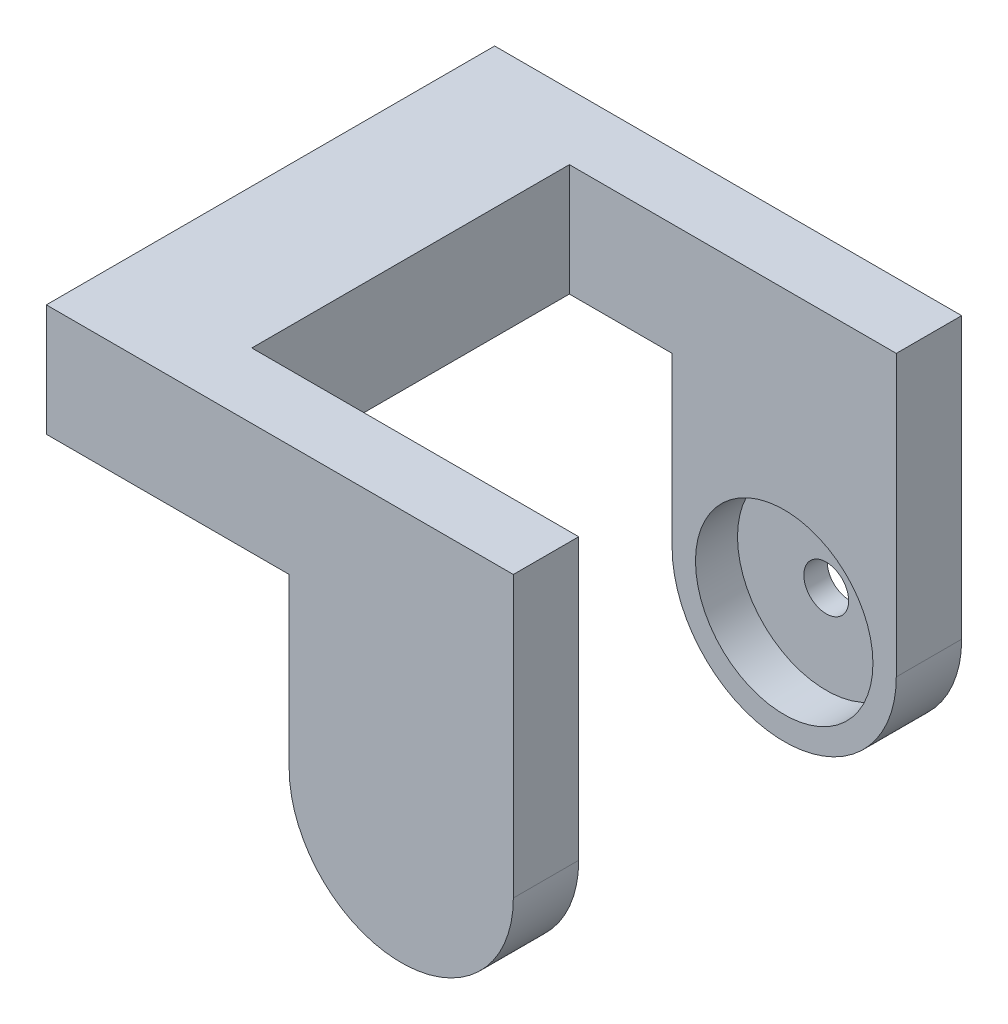
ISO-10303-21;
HEADER;
FILE_DESCRIPTION(('STEP AP214'),'2;1');
FILE_NAME('part.step','',(''),(''),'','','');
FILE_SCHEMA(('AUTOMOTIVE_DESIGN { 1 0 10303 214 1 1 1 1 }'));
ENDSEC;
DATA;
#1=APPLICATION_CONTEXT('core data for automotive mechanical design processes');
#2=APPLICATION_PROTOCOL_DEFINITION('international standard','automotive_design',2000,#1);
#3=PRODUCT_CONTEXT('',#1,'mechanical');
#4=PRODUCT('Part','Part','',(#3));
#5=PRODUCT_RELATED_PRODUCT_CATEGORY('part','',(#4));
#6=PRODUCT_DEFINITION_FORMATION('','',#4);
#7=PRODUCT_DEFINITION_CONTEXT('part definition',#1,'design');
#8=PRODUCT_DEFINITION('design','',#6,#7);
#9=PRODUCT_DEFINITION_SHAPE('','',#8);
#10=(LENGTH_UNIT() NAMED_UNIT(*) SI_UNIT(.MILLI.,.METRE.));
#11=(NAMED_UNIT(*) PLANE_ANGLE_UNIT() SI_UNIT($,.RADIAN.));
#12=(NAMED_UNIT(*) SI_UNIT($,.STERADIAN.) SOLID_ANGLE_UNIT());
#13=UNCERTAINTY_MEASURE_WITH_UNIT(LENGTH_MEASURE(1.E-05),#10,'distance_accuracy_value','');
#14=(GEOMETRIC_REPRESENTATION_CONTEXT(3) GLOBAL_UNCERTAINTY_ASSIGNED_CONTEXT((#13)) GLOBAL_UNIT_ASSIGNED_CONTEXT((#10,
#11,#12)) REPRESENTATION_CONTEXT('',''));
#15=CARTESIAN_POINT('',(0.,0.,0.));
#16=DIRECTION('',(0.,0.,1.));
#17=DIRECTION('',(1.,0.,0.));
#18=AXIS2_PLACEMENT_3D('',#15,#16,#17);
#19=CARTESIAN_POINT('',(12.,0.,-48.));
#20=DIRECTION('',(1.,0.,0.));
#21=DIRECTION('',(0.,0.,-1.));
#22=AXIS2_PLACEMENT_3D('',#19,#20,#21);
#23=PLANE('',#22);
#24=DIRECTION('',(0.,1.,0.));
#25=VECTOR('',#24,1.);
#26=CARTESIAN_POINT('',(12.,-12.,-7.));
#27=LINE('',#26,#25);
#28=CARTESIAN_POINT('',(12.,0.,-7.));
#29=VERTEX_POINT('',#28);
#30=CARTESIAN_POINT('',(12.,30.,-7.));
#31=VERTEX_POINT('',#30);
#32=EDGE_CURVE('E156',#29,#31,#27,.T.);
#33=ORIENTED_EDGE('',*,*,#32,.T.);
#34=DIRECTION('',(0.,0.,1.));
#35=VECTOR('',#34,1.);
#36=CARTESIAN_POINT('',(12.,30.,-48.));
#37=LINE('',#36,#35);
#38=CARTESIAN_POINT('',(12.,30.,0.));
#39=VERTEX_POINT('',#38);
#40=EDGE_CURVE('E170',#31,#39,#37,.T.);
#41=ORIENTED_EDGE('',*,*,#40,.T.);
#42=DIRECTION('',(0.,1.,0.));
#43=VECTOR('',#42,1.);
#44=CARTESIAN_POINT('',(12.,0.,0.));
#45=LINE('',#44,#43);
#46=CARTESIAN_POINT('',(12.,0.,0.));
#47=VERTEX_POINT('',#46);
#48=EDGE_CURVE('E264',#47,#39,#45,.T.);
#49=ORIENTED_EDGE('',*,*,#48,.F.);
#50=DIRECTION('',(0.,0.,1.));
#51=VECTOR('',#50,1.);
#52=CARTESIAN_POINT('',(12.,0.,-48.));
#53=LINE('',#52,#51);
#54=EDGE_CURVE('E91',#29,#47,#53,.T.);
#55=ORIENTED_EDGE('',*,*,#54,.F.);
#56=EDGE_LOOP('',(#33,#41,#49,#55));
#57=FACE_BOUND('',#56,.T.);
#58=ADVANCED_FACE('F47',(#57),#23,.T.);
#59=CARTESIAN_POINT('',(-12.,0.,-48.));
#60=DIRECTION('',(1.,0.,0.));
#61=DIRECTION('',(0.,0.,-1.));
#62=AXIS2_PLACEMENT_3D('',#59,#60,#61);
#63=PLANE('',#62);
#64=DIRECTION('',(0.,1.,0.));
#65=VECTOR('',#64,1.);
#66=CARTESIAN_POINT('',(-12.,0.,0.));
#67=LINE('',#66,#65);
#68=CARTESIAN_POINT('',(-12.,0.,0.));
#69=VERTEX_POINT('',#68);
#70=CARTESIAN_POINT('',(-12.,18.,0.));
#71=VERTEX_POINT('',#70);
#72=EDGE_CURVE('E284',#69,#71,#67,.T.);
#73=ORIENTED_EDGE('',*,*,#72,.T.);
#74=DIRECTION('',(0.,0.,-1.));
#75=VECTOR('',#74,1.);
#76=CARTESIAN_POINT('',(-12.,18.,0.));
#77=LINE('',#76,#75);
#78=CARTESIAN_POINT('',(-12.,18.,-6.99999999999999));
#79=VERTEX_POINT('',#78);
#80=EDGE_CURVE('E229',#71,#79,#77,.T.);
#81=ORIENTED_EDGE('',*,*,#80,.T.);
#82=DIRECTION('',(0.,1.,0.));
#83=VECTOR('',#82,1.);
#84=CARTESIAN_POINT('',(-12.,-12.,-7.));
#85=LINE('',#84,#83);
#86=CARTESIAN_POINT('',(-12.,0.,-7.));
#87=VERTEX_POINT('',#86);
#88=EDGE_CURVE('E248',#87,#79,#85,.T.);
#89=ORIENTED_EDGE('',*,*,#88,.F.);
#90=DIRECTION('',(0.,0.,1.));
#91=VECTOR('',#90,1.);
#92=CARTESIAN_POINT('',(-12.,0.,-48.));
#93=LINE('',#92,#91);
#94=EDGE_CURVE('E169',#87,#69,#93,.T.);
#95=ORIENTED_EDGE('',*,*,#94,.T.);
#96=EDGE_LOOP('',(#73,#81,#89,#95));
#97=FACE_BOUND('',#96,.T.);
#98=ADVANCED_FACE('F341',(#97),#63,.F.);
#99=CARTESIAN_POINT('',(0.,0.,-48.));
#100=DIRECTION('',(0.,0.,1.));
#101=DIRECTION('',(1.,0.,0.));
#102=AXIS2_PLACEMENT_3D('',#99,#100,#101);
#103=CYLINDRICAL_SURFACE('',#102,9.5);
#104=CARTESIAN_POINT('',(0.,0.,-41.));
#105=DIRECTION('',(0.,0.,-1.));
#106=DIRECTION('',(-1.,0.,0.));
#107=AXIS2_PLACEMENT_3D('',#104,#105,#106);
#108=CIRCLE('',#107,9.5);
#109=CARTESIAN_POINT('',(-9.5,0.,-41.));
#110=VERTEX_POINT('',#109);
#111=EDGE_CURVE('E155',#110,#110,#108,.F.);
#112=ORIENTED_EDGE('',*,*,#111,.T.);
#113=EDGE_LOOP('',(#112));
#114=FACE_BOUND('',#113,.T.);
#115=CARTESIAN_POINT('',(0.,0.,-45.5));
#116=DIRECTION('',(0.,0.,-1.));
#117=DIRECTION('',(-1.,0.,0.));
#118=AXIS2_PLACEMENT_3D('',#115,#116,#117);
#119=CIRCLE('',#118,9.5);
#120=CARTESIAN_POINT('',(-9.5,0.,-45.5));
#121=VERTEX_POINT('',#120);
#122=EDGE_CURVE('E182',#121,#121,#119,.F.);
#123=ORIENTED_EDGE('',*,*,#122,.F.);
#124=EDGE_LOOP('',(#123));
#125=FACE_BOUND('',#124,.T.);
#126=ADVANCED_FACE('F346',(#114,#125),#103,.F.);
#127=CARTESIAN_POINT('',(0.,0.,-48.));
#128=DIRECTION('',(0.,0.,1.));
#129=DIRECTION('',(1.,0.,0.));
#130=AXIS2_PLACEMENT_3D('',#127,#128,#129);
#131=CYLINDRICAL_SURFACE('',#130,12.);
#132=CARTESIAN_POINT('',(0.,0.,-7.));
#133=DIRECTION('',(0.,0.,1.));
#134=DIRECTION('',(0.,-1.,0.));
#135=AXIS2_PLACEMENT_3D('',#132,#133,#134);
#136=CIRCLE('',#135,12.);
#137=EDGE_CURVE('E261',#29,#87,#136,.F.);
#138=ORIENTED_EDGE('',*,*,#137,.F.);
#139=ORIENTED_EDGE('',*,*,#54,.T.);
#140=CARTESIAN_POINT('',(0.,0.,0.));
#141=DIRECTION('',(0.,0.,1.));
#142=DIRECTION('',(1.,0.,0.));
#143=AXIS2_PLACEMENT_3D('',#140,#141,#142);
#144=CIRCLE('',#143,12.);
#145=EDGE_CURVE('E267',#69,#47,#144,.T.);
#146=ORIENTED_EDGE('',*,*,#145,.F.);
#147=ORIENTED_EDGE('',*,*,#94,.F.);
#148=EDGE_LOOP('',(#138,#139,#146,#147));
#149=FACE_BOUND('',#148,.T.);
#150=ADVANCED_FACE('F350',(#149),#131,.T.);
#151=CARTESIAN_POINT('',(12.,30.,-48.));
#152=VERTEX_POINT('',#151);
#153=CARTESIAN_POINT('',(12.,30.,-41.));
#154=VERTEX_POINT('',#153);
#155=EDGE_CURVE('E161',#152,#154,#37,.T.);
#156=ORIENTED_EDGE('',*,*,#155,.T.);
#157=DIRECTION('',(0.,-1.,0.));
#158=VECTOR('',#157,1.);
#159=CARTESIAN_POINT('',(12.,-12.,-41.));
#160=LINE('',#159,#158);
#161=CARTESIAN_POINT('',(12.,0.,-41.));
#162=VERTEX_POINT('',#161);
#163=EDGE_CURVE('E145',#154,#162,#160,.T.);
#164=ORIENTED_EDGE('',*,*,#163,.T.);
#165=CARTESIAN_POINT('',(12.,0.,-48.));
#166=VERTEX_POINT('',#165);
#167=EDGE_CURVE('E72',#166,#162,#53,.T.);
#168=ORIENTED_EDGE('',*,*,#167,.F.);
#169=DIRECTION('',(0.,1.,0.));
#170=VECTOR('',#169,1.);
#171=CARTESIAN_POINT('',(12.,0.,-48.));
#172=LINE('',#171,#170);
#173=EDGE_CURVE('E167',#166,#152,#172,.T.);
#174=ORIENTED_EDGE('',*,*,#173,.T.);
#175=EDGE_LOOP('',(#156,#164,#168,#174));
#176=FACE_BOUND('',#175,.T.);
#177=ADVANCED_FACE('F49',(#176),#23,.T.);
#178=CARTESIAN_POINT('',(0.,0.,-41.));
#179=DIRECTION('',(0.,0.,-1.));
#180=DIRECTION('',(-1.,0.,0.));
#181=AXIS2_PLACEMENT_3D('',#178,#179,#180);
#182=CIRCLE('',#181,12.);
#183=CARTESIAN_POINT('',(-12.,0.,-41.));
#184=VERTEX_POINT('',#183);
#185=EDGE_CURVE('E152',#184,#162,#182,.F.);
#186=ORIENTED_EDGE('',*,*,#185,.F.);
#187=CARTESIAN_POINT('',(-12.,0.,-48.));
#188=VERTEX_POINT('',#187);
#189=EDGE_CURVE('E174',#188,#184,#93,.T.);
#190=ORIENTED_EDGE('',*,*,#189,.F.);
#191=CARTESIAN_POINT('',(0.,0.,-48.));
#192=DIRECTION('',(0.,0.,1.));
#193=DIRECTION('',(1.,0.,0.));
#194=AXIS2_PLACEMENT_3D('',#191,#192,#193);
#195=CIRCLE('',#194,12.);
#196=EDGE_CURVE('E176',#188,#166,#195,.T.);
#197=ORIENTED_EDGE('',*,*,#196,.T.);
#198=ORIENTED_EDGE('',*,*,#167,.T.);
#199=EDGE_LOOP('',(#186,#190,#197,#198));
#200=FACE_BOUND('',#199,.T.);
#201=ADVANCED_FACE('F301',(#200),#131,.T.);
#202=DIRECTION('',(0.,-1.,0.));
#203=VECTOR('',#202,1.);
#204=CARTESIAN_POINT('',(-12.,-12.,-41.));
#205=LINE('',#204,#203);
#206=CARTESIAN_POINT('',(-12.,18.,-41.));
#207=VERTEX_POINT('',#206);
#208=EDGE_CURVE('E253',#207,#184,#205,.T.);
#209=ORIENTED_EDGE('',*,*,#208,.F.);
#210=CARTESIAN_POINT('',(-12.,18.,-48.));
#211=VERTEX_POINT('',#210);
#212=EDGE_CURVE('E232',#207,#211,#77,.T.);
#213=ORIENTED_EDGE('',*,*,#212,.T.);
#214=DIRECTION('',(0.,1.,0.));
#215=VECTOR('',#214,1.);
#216=CARTESIAN_POINT('',(-12.,0.,-48.));
#217=LINE('',#216,#215);
#218=EDGE_CURVE('E270',#188,#211,#217,.T.);
#219=ORIENTED_EDGE('',*,*,#218,.F.);
#220=ORIENTED_EDGE('',*,*,#189,.T.);
#221=EDGE_LOOP('',(#209,#213,#219,#220));
#222=FACE_BOUND('',#221,.T.);
#223=ADVANCED_FACE('F298',(#222),#63,.F.);
#224=CARTESIAN_POINT('',(0.,30.,-48.));
#225=DIRECTION('',(0.,-1.,0.));
#226=DIRECTION('',(0.,0.,-1.));
#227=AXIS2_PLACEMENT_3D('',#224,#225,#226);
#228=PLANE('',#227);
#229=ORIENTED_EDGE('',*,*,#40,.F.);
#230=DIRECTION('',(1.,0.,0.));
#231=VECTOR('',#230,1.);
#232=CARTESIAN_POINT('',(12.,30.,-7.));
#233=LINE('',#232,#231);
#234=CARTESIAN_POINT('',(-23.,30.,-6.99999999999999));
#235=VERTEX_POINT('',#234);
#236=EDGE_CURVE('E209',#235,#31,#233,.T.);
#237=ORIENTED_EDGE('',*,*,#236,.F.);
#238=DIRECTION('',(0.,0.,1.));
#239=VECTOR('',#238,1.);
#240=CARTESIAN_POINT('',(-23.,30.,-41.));
#241=LINE('',#240,#239);
#242=CARTESIAN_POINT('',(-23.,30.,-41.));
#243=VERTEX_POINT('',#242);
#244=EDGE_CURVE('E164',#243,#235,#241,.T.);
#245=ORIENTED_EDGE('',*,*,#244,.F.);
#246=DIRECTION('',(-1.,0.,0.));
#247=VECTOR('',#246,1.);
#248=CARTESIAN_POINT('',(12.,30.,-41.));
#249=LINE('',#248,#247);
#250=EDGE_CURVE('E149',#154,#243,#249,.T.);
#251=ORIENTED_EDGE('',*,*,#250,.F.);
#252=ORIENTED_EDGE('',*,*,#155,.F.);
#253=DIRECTION('',(1.,0.,0.));
#254=VECTOR('',#253,1.);
#255=CARTESIAN_POINT('',(0.,30.,-48.));
#256=LINE('',#255,#254);
#257=CARTESIAN_POINT('',(-38.,30.,-48.));
#258=VERTEX_POINT('',#257);
#259=EDGE_CURVE('E97',#258,#152,#256,.T.);
#260=ORIENTED_EDGE('',*,*,#259,.F.);
#261=DIRECTION('',(0.,0.,-1.));
#262=VECTOR('',#261,1.);
#263=CARTESIAN_POINT('',(-38.,30.,0.));
#264=LINE('',#263,#262);
#265=CARTESIAN_POINT('',(-38.,30.,0.));
#266=VERTEX_POINT('',#265);
#267=EDGE_CURVE('E220',#266,#258,#264,.T.);
#268=ORIENTED_EDGE('',*,*,#267,.F.);
#269=DIRECTION('',(1.,0.,0.));
#270=VECTOR('',#269,1.);
#271=CARTESIAN_POINT('',(0.,30.,0.));
#272=LINE('',#271,#270);
#273=EDGE_CURVE('E280',#266,#39,#272,.T.);
#274=ORIENTED_EDGE('',*,*,#273,.T.);
#275=EDGE_LOOP('',(#229,#237,#245,#251,#252,#260,#268,#274));
#276=FACE_BOUND('',#275,.T.);
#277=ADVANCED_FACE('F160',(#276),#228,.F.);
#278=CARTESIAN_POINT('',(0.,0.,-48.));
#279=DIRECTION('',(0.,0.,1.));
#280=DIRECTION('',(1.,0.,0.));
#281=AXIS2_PLACEMENT_3D('',#278,#279,#280);
#282=PLANE('',#281);
#283=ORIENTED_EDGE('',*,*,#173,.F.);
#284=ORIENTED_EDGE('',*,*,#196,.F.);
#285=ORIENTED_EDGE('',*,*,#218,.T.);
#286=DIRECTION('',(-1.,0.,0.));
#287=VECTOR('',#286,1.);
#288=CARTESIAN_POINT('',(0.,18.,-48.));
#289=LINE('',#288,#287);
#290=CARTESIAN_POINT('',(-38.,18.,-48.));
#291=VERTEX_POINT('',#290);
#292=EDGE_CURVE('E207',#211,#291,#289,.T.);
#293=ORIENTED_EDGE('',*,*,#292,.T.);
#294=DIRECTION('',(0.,-1.,0.));
#295=VECTOR('',#294,1.);
#296=CARTESIAN_POINT('',(-38.,0.,-48.));
#297=LINE('',#296,#295);
#298=EDGE_CURVE('E202',#258,#291,#297,.T.);
#299=ORIENTED_EDGE('',*,*,#298,.F.);
#300=ORIENTED_EDGE('',*,*,#259,.T.);
#301=EDGE_LOOP('',(#283,#284,#285,#293,#299,#300));
#302=FACE_BOUND('',#301,.T.);
#303=CARTESIAN_POINT('',(0.,0.,-48.));
#304=DIRECTION('',(0.,0.,-1.));
#305=DIRECTION('',(-1.,0.,0.));
#306=AXIS2_PLACEMENT_3D('',#303,#304,#305);
#307=CIRCLE('',#306,2.4);
#308=CARTESIAN_POINT('',(-2.4,0.,-48.));
#309=VERTEX_POINT('',#308);
#310=EDGE_CURVE('E243',#309,#309,#307,.T.);
#311=ORIENTED_EDGE('',*,*,#310,.F.);
#312=EDGE_LOOP('',(#311));
#313=FACE_BOUND('',#312,.T.);
#314=ADVANCED_FACE('F302',(#302,#313),#282,.F.);
#315=CARTESIAN_POINT('',(0.,0.,0.));
#316=DIRECTION('',(0.,0.,1.));
#317=DIRECTION('',(1.,0.,0.));
#318=AXIS2_PLACEMENT_3D('',#315,#316,#317);
#319=PLANE('',#318);
#320=ORIENTED_EDGE('',*,*,#48,.T.);
#321=ORIENTED_EDGE('',*,*,#273,.F.);
#322=DIRECTION('',(0.,-1.,0.));
#323=VECTOR('',#322,1.);
#324=CARTESIAN_POINT('',(-38.,0.,0.));
#325=LINE('',#324,#323);
#326=CARTESIAN_POINT('',(-38.,18.,0.));
#327=VERTEX_POINT('',#326);
#328=EDGE_CURVE('E214',#266,#327,#325,.T.);
#329=ORIENTED_EDGE('',*,*,#328,.T.);
#330=DIRECTION('',(-1.,0.,0.));
#331=VECTOR('',#330,1.);
#332=CARTESIAN_POINT('',(0.,18.,0.));
#333=LINE('',#332,#331);
#334=EDGE_CURVE('E217',#71,#327,#333,.T.);
#335=ORIENTED_EDGE('',*,*,#334,.F.);
#336=ORIENTED_EDGE('',*,*,#72,.F.);
#337=ORIENTED_EDGE('',*,*,#145,.T.);
#338=EDGE_LOOP('',(#320,#321,#329,#335,#336,#337));
#339=FACE_BOUND('',#338,.T.);
#340=ADVANCED_FACE('F312',(#339),#319,.T.);
#341=CARTESIAN_POINT('',(12.,-12.,-7.));
#342=DIRECTION('',(0.,0.,1.));
#343=DIRECTION('',(0.,-1.,0.));
#344=AXIS2_PLACEMENT_3D('',#341,#342,#343);
#345=PLANE('',#344);
#346=ORIENTED_EDGE('',*,*,#88,.T.);
#347=DIRECTION('',(1.,0.,0.));
#348=VECTOR('',#347,1.);
#349=CARTESIAN_POINT('',(12.,18.,-7.));
#350=LINE('',#349,#348);
#351=CARTESIAN_POINT('',(-23.,18.,-6.99999999999999));
#352=VERTEX_POINT('',#351);
#353=EDGE_CURVE('E11',#352,#79,#350,.T.);
#354=ORIENTED_EDGE('',*,*,#353,.F.);
#355=DIRECTION('',(0.,1.,0.));
#356=VECTOR('',#355,1.);
#357=CARTESIAN_POINT('',(-23.,15.5,-6.99999999999999));
#358=LINE('',#357,#356);
#359=EDGE_CURVE('E198',#352,#235,#358,.T.);
#360=ORIENTED_EDGE('',*,*,#359,.T.);
#361=ORIENTED_EDGE('',*,*,#236,.T.);
#362=ORIENTED_EDGE('',*,*,#32,.F.);
#363=ORIENTED_EDGE('',*,*,#137,.T.);
#364=EDGE_LOOP('',(#346,#354,#360,#361,#362,#363));
#365=FACE_BOUND('',#364,.T.);
#366=CARTESIAN_POINT('',(0.,0.,-7.));
#367=DIRECTION('',(0.,0.,1.));
#368=DIRECTION('',(0.,-1.,0.));
#369=AXIS2_PLACEMENT_3D('',#366,#367,#368);
#370=CIRCLE('',#369,4.2);
#371=CARTESIAN_POINT('',(0.,-4.2,-7.));
#372=VERTEX_POINT('',#371);
#373=EDGE_CURVE('E239',#372,#372,#370,.T.);
#374=ORIENTED_EDGE('',*,*,#373,.T.);
#375=EDGE_LOOP('',(#374));
#376=FACE_BOUND('',#375,.T.);
#377=ADVANCED_FACE('F316',(#365,#376),#345,.F.);
#378=CARTESIAN_POINT('',(12.,-12.,-41.));
#379=DIRECTION('',(0.,0.,-1.));
#380=DIRECTION('',(-1.,0.,0.));
#381=AXIS2_PLACEMENT_3D('',#378,#379,#380);
#382=PLANE('',#381);
#383=ORIENTED_EDGE('',*,*,#185,.T.);
#384=ORIENTED_EDGE('',*,*,#163,.F.);
#385=ORIENTED_EDGE('',*,*,#250,.T.);
#386=DIRECTION('',(0.,1.,0.));
#387=VECTOR('',#386,1.);
#388=CARTESIAN_POINT('',(-23.,15.5,-41.));
#389=LINE('',#388,#387);
#390=CARTESIAN_POINT('',(-23.,18.,-41.));
#391=VERTEX_POINT('',#390);
#392=EDGE_CURVE('E63',#391,#243,#389,.T.);
#393=ORIENTED_EDGE('',*,*,#392,.F.);
#394=DIRECTION('',(-1.,0.,0.));
#395=VECTOR('',#394,1.);
#396=CARTESIAN_POINT('',(12.,18.,-41.));
#397=LINE('',#396,#395);
#398=EDGE_CURVE('E186',#207,#391,#397,.T.);
#399=ORIENTED_EDGE('',*,*,#398,.F.);
#400=ORIENTED_EDGE('',*,*,#208,.T.);
#401=EDGE_LOOP('',(#383,#384,#385,#393,#399,#400));
#402=FACE_BOUND('',#401,.T.);
#403=ORIENTED_EDGE('',*,*,#111,.F.);
#404=EDGE_LOOP('',(#403));
#405=FACE_BOUND('',#404,.T.);
#406=ADVANCED_FACE('F147',(#402,#405),#382,.F.);
#407=CARTESIAN_POINT('',(12.,18.,-7.));
#408=DIRECTION('',(0.,1.,0.));
#409=DIRECTION('',(0.,0.,1.));
#410=AXIS2_PLACEMENT_3D('',#407,#408,#409);
#411=PLANE('',#410);
#412=DIRECTION('',(0.,0.,1.));
#413=VECTOR('',#412,1.);
#414=CARTESIAN_POINT('',(-23.,18.,-6.99999999999999));
#415=LINE('',#414,#413);
#416=EDGE_CURVE('E56',#391,#352,#415,.T.);
#417=ORIENTED_EDGE('',*,*,#416,.T.);
#418=ORIENTED_EDGE('',*,*,#353,.T.);
#419=ORIENTED_EDGE('',*,*,#80,.F.);
#420=ORIENTED_EDGE('',*,*,#334,.T.);
#421=DIRECTION('',(0.,0.,-1.));
#422=VECTOR('',#421,1.);
#423=CARTESIAN_POINT('',(-38.,18.,0.));
#424=LINE('',#423,#422);
#425=EDGE_CURVE('E225',#327,#291,#424,.T.);
#426=ORIENTED_EDGE('',*,*,#425,.T.);
#427=ORIENTED_EDGE('',*,*,#292,.F.);
#428=ORIENTED_EDGE('',*,*,#212,.F.);
#429=ORIENTED_EDGE('',*,*,#398,.T.);
#430=EDGE_LOOP('',(#417,#418,#419,#420,#426,#427,#428,#429));
#431=FACE_BOUND('',#430,.T.);
#432=ADVANCED_FACE('F192',(#431),#411,.F.);
#433=CARTESIAN_POINT('',(0.,0.,-45.5));
#434=DIRECTION('',(0.,0.,-1.));
#435=DIRECTION('',(-1.,0.,0.));
#436=AXIS2_PLACEMENT_3D('',#433,#434,#435);
#437=PLANE('',#436);
#438=CARTESIAN_POINT('',(0.,0.,-45.5));
#439=DIRECTION('',(0.,0.,-1.));
#440=DIRECTION('',(-1.,0.,0.));
#441=AXIS2_PLACEMENT_3D('',#438,#439,#440);
#442=CIRCLE('',#441,2.4);
#443=CARTESIAN_POINT('',(-2.4,0.,-45.5));
#444=VERTEX_POINT('',#443);
#445=EDGE_CURVE('E244',#444,#444,#442,.T.);
#446=ORIENTED_EDGE('',*,*,#445,.T.);
#447=EDGE_LOOP('',(#446));
#448=FACE_BOUND('',#447,.T.);
#449=ORIENTED_EDGE('',*,*,#122,.T.);
#450=EDGE_LOOP('',(#449));
#451=FACE_BOUND('',#450,.T.);
#452=ADVANCED_FACE('F337',(#448,#451),#437,.F.);
#453=CARTESIAN_POINT('',(0.,0.,-45.5));
#454=DIRECTION('',(0.,0.,-1.));
#455=DIRECTION('',(-1.,0.,0.));
#456=AXIS2_PLACEMENT_3D('',#453,#454,#455);
#457=CYLINDRICAL_SURFACE('',#456,2.4);
#458=ORIENTED_EDGE('',*,*,#445,.F.);
#459=EDGE_LOOP('',(#458));
#460=FACE_BOUND('',#459,.T.);
#461=ORIENTED_EDGE('',*,*,#310,.T.);
#462=EDGE_LOOP('',(#461));
#463=FACE_BOUND('',#462,.T.);
#464=ADVANCED_FACE('F328',(#460,#463),#457,.F.);
#465=CARTESIAN_POINT('',(0.,0.,-11.));
#466=DIRECTION('',(0.,0.,1.));
#467=DIRECTION('',(1.,0.,0.));
#468=AXIS2_PLACEMENT_3D('',#465,#466,#467);
#469=CYLINDRICAL_SURFACE('',#468,4.2);
#470=CARTESIAN_POINT('',(0.,0.,-11.));
#471=DIRECTION('',(0.,0.,1.));
#472=DIRECTION('',(1.,0.,0.));
#473=AXIS2_PLACEMENT_3D('',#470,#471,#472);
#474=CIRCLE('',#473,4.2);
#475=CARTESIAN_POINT('',(4.2,0.,-11.));
#476=VERTEX_POINT('',#475);
#477=EDGE_CURVE('E228',#476,#476,#474,.T.);
#478=ORIENTED_EDGE('',*,*,#477,.T.);
#479=EDGE_LOOP('',(#478));
#480=FACE_BOUND('',#479,.T.);
#481=ORIENTED_EDGE('',*,*,#373,.F.);
#482=EDGE_LOOP('',(#481));
#483=FACE_BOUND('',#482,.T.);
#484=ADVANCED_FACE('F325',(#480,#483),#469,.T.);
#485=CARTESIAN_POINT('',(0.,0.,-11.));
#486=DIRECTION('',(0.,0.,1.));
#487=DIRECTION('',(1.,0.,0.));
#488=AXIS2_PLACEMENT_3D('',#485,#486,#487);
#489=PLANE('',#488);
#490=ORIENTED_EDGE('',*,*,#477,.F.);
#491=EDGE_LOOP('',(#490));
#492=FACE_BOUND('',#491,.T.);
#493=ADVANCED_FACE('F327',(#492),#489,.F.);
#494=CARTESIAN_POINT('',(-38.,0.,0.));
#495=DIRECTION('',(1.,0.,0.));
#496=DIRECTION('',(0.,0.,-1.));
#497=AXIS2_PLACEMENT_3D('',#494,#495,#496);
#498=PLANE('',#497);
#499=ORIENTED_EDGE('',*,*,#298,.T.);
#500=ORIENTED_EDGE('',*,*,#425,.F.);
#501=ORIENTED_EDGE('',*,*,#328,.F.);
#502=ORIENTED_EDGE('',*,*,#267,.T.);
#503=EDGE_LOOP('',(#499,#500,#501,#502));
#504=FACE_BOUND('',#503,.T.);
#505=ADVANCED_FACE('F309',(#504),#498,.F.);
#506=CARTESIAN_POINT('',(-23.,15.5,-41.));
#507=DIRECTION('',(-1.,0.,0.));
#508=DIRECTION('',(0.,0.,1.));
#509=AXIS2_PLACEMENT_3D('',#506,#507,#508);
#510=PLANE('',#509);
#511=ORIENTED_EDGE('',*,*,#392,.T.);
#512=ORIENTED_EDGE('',*,*,#244,.T.);
#513=ORIENTED_EDGE('',*,*,#359,.F.);
#514=ORIENTED_EDGE('',*,*,#416,.F.);
#515=EDGE_LOOP('',(#511,#512,#513,#514));
#516=FACE_BOUND('',#515,.T.);
#517=ADVANCED_FACE('F197',(#516),#510,.F.);
#518=CLOSED_SHELL('',(#58,#98,#126,#150,#177,#201,#223,#277,#314,#340,#377,#406,#432,#452,#464,
#484,#493,#505,#517));
#519=MANIFOLD_SOLID_BREP('B2',#518);
#520=ADVANCED_BREP_SHAPE_REPRESENTATION('',(#18,#519),#14);
#521=SHAPE_DEFINITION_REPRESENTATION(#9,#520);
ENDSEC;
END-ISO-10303-21;
